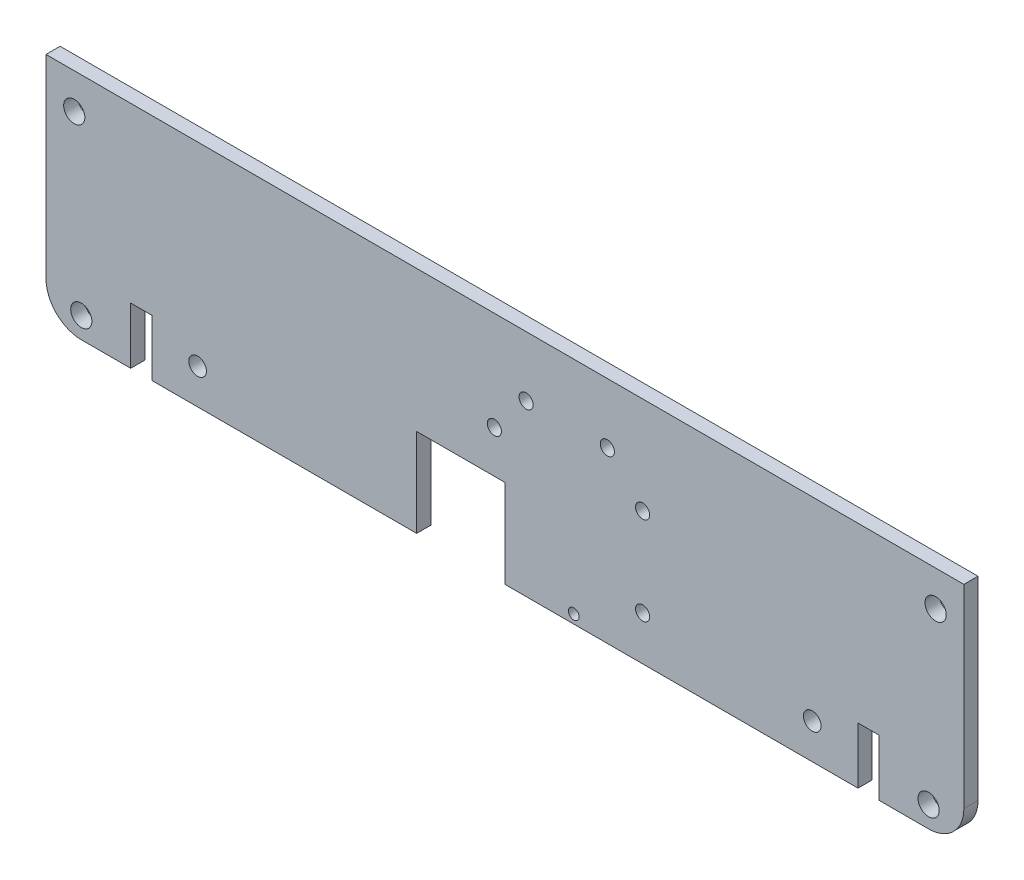
ISO-10303-21;
HEADER;
FILE_DESCRIPTION(('STEP AP214'),'2;1');
FILE_NAME('part.step','',(''),(''),'','','');
FILE_SCHEMA(('AUTOMOTIVE_DESIGN { 1 0 10303 214 1 1 1 1 }'));
ENDSEC;
DATA;
#1=APPLICATION_CONTEXT('core data for automotive mechanical design processes');
#2=APPLICATION_PROTOCOL_DEFINITION('international standard','automotive_design',2000,#1);
#3=PRODUCT_CONTEXT('',#1,'mechanical');
#4=PRODUCT('Part','Part','',(#3));
#5=PRODUCT_RELATED_PRODUCT_CATEGORY('part','',(#4));
#6=PRODUCT_DEFINITION_FORMATION('','',#4);
#7=PRODUCT_DEFINITION_CONTEXT('part definition',#1,'design');
#8=PRODUCT_DEFINITION('design','',#6,#7);
#9=PRODUCT_DEFINITION_SHAPE('','',#8);
#10=(LENGTH_UNIT() NAMED_UNIT(*) SI_UNIT(.MILLI.,.METRE.));
#11=(NAMED_UNIT(*) PLANE_ANGLE_UNIT() SI_UNIT($,.RADIAN.));
#12=(NAMED_UNIT(*) SI_UNIT($,.STERADIAN.) SOLID_ANGLE_UNIT());
#13=UNCERTAINTY_MEASURE_WITH_UNIT(LENGTH_MEASURE(1.E-05),#10,'distance_accuracy_value','');
#14=(GEOMETRIC_REPRESENTATION_CONTEXT(3) GLOBAL_UNCERTAINTY_ASSIGNED_CONTEXT((#13)) GLOBAL_UNIT_ASSIGNED_CONTEXT((#10,
#11,#12)) REPRESENTATION_CONTEXT('',''));
#15=CARTESIAN_POINT('',(0.,0.,0.));
#16=DIRECTION('',(0.,0.,1.));
#17=DIRECTION('',(1.,0.,0.));
#18=AXIS2_PLACEMENT_3D('',#15,#16,#17);
#19=CARTESIAN_POINT('',(-130.,-32.5,4.));
#20=DIRECTION('',(0.,1.,0.));
#21=DIRECTION('',(0.,0.,1.));
#22=AXIS2_PLACEMENT_3D('',#19,#20,#21);
#23=PLANE('',#22);
#24=DIRECTION('',(1.,0.,0.));
#25=VECTOR('',#24,1.);
#26=CARTESIAN_POINT('',(-130.,-32.5,4.));
#27=LINE('',#26,#25);
#28=CARTESIAN_POINT('',(-100.,-32.5,4.));
#29=VERTEX_POINT('',#28);
#30=CARTESIAN_POINT('',(-25.,-32.5,4.));
#31=VERTEX_POINT('',#30);
#32=EDGE_CURVE('E185',#29,#31,#27,.T.);
#33=ORIENTED_EDGE('',*,*,#32,.F.);
#34=DIRECTION('',(0.,0.,-1.));
#35=VECTOR('',#34,1.);
#36=CARTESIAN_POINT('',(-100.,-32.5,4.));
#37=LINE('',#36,#35);
#38=CARTESIAN_POINT('',(-100.,-32.5,0.));
#39=VERTEX_POINT('',#38);
#40=EDGE_CURVE('E275',#29,#39,#37,.T.);
#41=ORIENTED_EDGE('',*,*,#40,.T.);
#42=DIRECTION('',(1.,0.,0.));
#43=VECTOR('',#42,1.);
#44=CARTESIAN_POINT('',(-130.,-32.5,0.));
#45=LINE('',#44,#43);
#46=CARTESIAN_POINT('',(-25.,-32.5,0.));
#47=VERTEX_POINT('',#46);
#48=EDGE_CURVE('E375',#39,#47,#45,.T.);
#49=ORIENTED_EDGE('',*,*,#48,.T.);
#50=DIRECTION('',(0.,0.,-1.));
#51=VECTOR('',#50,1.);
#52=CARTESIAN_POINT('',(-25.,-32.5,10.));
#53=LINE('',#52,#51);
#54=EDGE_CURVE('E244',#31,#47,#53,.T.);
#55=ORIENTED_EDGE('',*,*,#54,.F.);
#56=EDGE_LOOP('',(#33,#41,#49,#55));
#57=FACE_BOUND('',#56,.T.);
#58=ADVANCED_FACE('F33',(#57),#23,.F.);
#59=CARTESIAN_POINT('',(106.,-32.5,4.));
#60=VERTEX_POINT('',#59);
#61=CARTESIAN_POINT('',(120.,-32.5,4.));
#62=VERTEX_POINT('',#61);
#63=EDGE_CURVE('E191',#60,#62,#27,.T.);
#64=ORIENTED_EDGE('',*,*,#63,.F.);
#65=DIRECTION('',(0.,0.,-1.));
#66=VECTOR('',#65,1.);
#67=CARTESIAN_POINT('',(106.,-32.5,4.));
#68=LINE('',#67,#66);
#69=CARTESIAN_POINT('',(106.,-32.5,0.));
#70=VERTEX_POINT('',#69);
#71=EDGE_CURVE('E259',#60,#70,#68,.T.);
#72=ORIENTED_EDGE('',*,*,#71,.T.);
#73=CARTESIAN_POINT('',(120.,-32.5,0.));
#74=VERTEX_POINT('',#73);
#75=EDGE_CURVE('E382',#70,#74,#45,.T.);
#76=ORIENTED_EDGE('',*,*,#75,.T.);
#77=DIRECTION('',(0.,0.,-1.));
#78=VECTOR('',#77,1.);
#79=CARTESIAN_POINT('',(120.,-32.5,4.));
#80=LINE('',#79,#78);
#81=EDGE_CURVE('E407',#74,#62,#80,.F.);
#82=ORIENTED_EDGE('',*,*,#81,.T.);
#83=EDGE_LOOP('',(#64,#72,#76,#82));
#84=FACE_BOUND('',#83,.T.);
#85=ADVANCED_FACE('F428',(#84),#23,.F.);
#86=CARTESIAN_POINT('',(0.,-32.5,0.));
#87=VERTEX_POINT('',#86);
#88=CARTESIAN_POINT('',(100.,-32.5,0.));
#89=VERTEX_POINT('',#88);
#90=EDGE_CURVE('E380',#87,#89,#45,.T.);
#91=ORIENTED_EDGE('',*,*,#90,.T.);
#92=DIRECTION('',(0.,0.,-1.));
#93=VECTOR('',#92,1.);
#94=CARTESIAN_POINT('',(100.,-32.5,4.));
#95=LINE('',#94,#93);
#96=CARTESIAN_POINT('',(100.,-32.5,4.));
#97=VERTEX_POINT('',#96);
#98=EDGE_CURVE('E56',#97,#89,#95,.T.);
#99=ORIENTED_EDGE('',*,*,#98,.F.);
#100=CARTESIAN_POINT('',(0.,-32.5,4.));
#101=VERTEX_POINT('',#100);
#102=EDGE_CURVE('E187',#101,#97,#27,.T.);
#103=ORIENTED_EDGE('',*,*,#102,.F.);
#104=DIRECTION('',(0.,0.,-1.));
#105=VECTOR('',#104,1.);
#106=CARTESIAN_POINT('',(0.,-32.5,10.));
#107=LINE('',#106,#105);
#108=EDGE_CURVE('E241',#101,#87,#107,.T.);
#109=ORIENTED_EDGE('',*,*,#108,.T.);
#110=EDGE_LOOP('',(#91,#99,#103,#109));
#111=FACE_BOUND('',#110,.T.);
#112=ADVANCED_FACE('F430',(#111),#23,.F.);
#113=CARTESIAN_POINT('',(130.,32.5,4.));
#114=DIRECTION('',(-1.,0.,0.));
#115=DIRECTION('',(0.,0.,1.));
#116=AXIS2_PLACEMENT_3D('',#113,#114,#115);
#117=PLANE('',#116);
#118=DIRECTION('',(0.,1.,0.));
#119=VECTOR('',#118,1.);
#120=CARTESIAN_POINT('',(130.,32.5,4.));
#121=LINE('',#120,#119);
#122=CARTESIAN_POINT('',(130.,-22.5,4.));
#123=VERTEX_POINT('',#122);
#124=CARTESIAN_POINT('',(130.,32.5,4.));
#125=VERTEX_POINT('',#124);
#126=EDGE_CURVE('E204',#123,#125,#121,.T.);
#127=ORIENTED_EDGE('',*,*,#126,.F.);
#128=DIRECTION('',(0.,0.,-1.));
#129=VECTOR('',#128,1.);
#130=CARTESIAN_POINT('',(130.,-22.5,4.));
#131=LINE('',#130,#129);
#132=CARTESIAN_POINT('',(130.,-22.5,0.));
#133=VERTEX_POINT('',#132);
#134=EDGE_CURVE('E11',#123,#133,#131,.T.);
#135=ORIENTED_EDGE('',*,*,#134,.T.);
#136=DIRECTION('',(0.,1.,0.));
#137=VECTOR('',#136,1.);
#138=CARTESIAN_POINT('',(130.,32.5,0.));
#139=LINE('',#138,#137);
#140=CARTESIAN_POINT('',(130.,32.5,0.));
#141=VERTEX_POINT('',#140);
#142=EDGE_CURVE('E215',#133,#141,#139,.T.);
#143=ORIENTED_EDGE('',*,*,#142,.T.);
#144=DIRECTION('',(0.,0.,-1.));
#145=VECTOR('',#144,1.);
#146=CARTESIAN_POINT('',(130.,32.5,4.));
#147=LINE('',#146,#145);
#148=EDGE_CURVE('E189',#125,#141,#147,.T.);
#149=ORIENTED_EDGE('',*,*,#148,.F.);
#150=EDGE_LOOP('',(#127,#135,#143,#149));
#151=FACE_BOUND('',#150,.T.);
#152=ADVANCED_FACE('F400',(#151),#117,.F.);
#153=CARTESIAN_POINT('',(-130.,32.5,4.));
#154=DIRECTION('',(0.,-1.,0.));
#155=DIRECTION('',(0.,0.,-1.));
#156=AXIS2_PLACEMENT_3D('',#153,#154,#155);
#157=PLANE('',#156);
#158=DIRECTION('',(-1.,0.,0.));
#159=VECTOR('',#158,1.);
#160=CARTESIAN_POINT('',(-130.,32.5,0.));
#161=LINE('',#160,#159);
#162=CARTESIAN_POINT('',(-130.,32.5,0.));
#163=VERTEX_POINT('',#162);
#164=EDGE_CURVE('E390',#141,#163,#161,.T.);
#165=ORIENTED_EDGE('',*,*,#164,.T.);
#166=DIRECTION('',(0.,0.,-1.));
#167=VECTOR('',#166,1.);
#168=CARTESIAN_POINT('',(-130.,32.5,4.));
#169=LINE('',#168,#167);
#170=CARTESIAN_POINT('',(-130.,32.5,4.));
#171=VERTEX_POINT('',#170);
#172=EDGE_CURVE('E184',#171,#163,#169,.T.);
#173=ORIENTED_EDGE('',*,*,#172,.F.);
#174=DIRECTION('',(-1.,0.,0.));
#175=VECTOR('',#174,1.);
#176=CARTESIAN_POINT('',(-130.,32.5,4.));
#177=LINE('',#176,#175);
#178=EDGE_CURVE('E202',#125,#171,#177,.T.);
#179=ORIENTED_EDGE('',*,*,#178,.F.);
#180=ORIENTED_EDGE('',*,*,#148,.T.);
#181=EDGE_LOOP('',(#165,#173,#179,#180));
#182=FACE_BOUND('',#181,.T.);
#183=ADVANCED_FACE('F406',(#182),#157,.F.);
#184=CARTESIAN_POINT('',(-130.,32.5,4.));
#185=DIRECTION('',(1.,0.,0.));
#186=DIRECTION('',(0.,0.,-1.));
#187=AXIS2_PLACEMENT_3D('',#184,#185,#186);
#188=PLANE('',#187);
#189=DIRECTION('',(0.,-1.,0.));
#190=VECTOR('',#189,1.);
#191=CARTESIAN_POINT('',(-130.,32.5,0.));
#192=LINE('',#191,#190);
#193=CARTESIAN_POINT('',(-130.,-22.5,0.));
#194=VERTEX_POINT('',#193);
#195=EDGE_CURVE('E385',#163,#194,#192,.T.);
#196=ORIENTED_EDGE('',*,*,#195,.T.);
#197=DIRECTION('',(0.,0.,-1.));
#198=VECTOR('',#197,1.);
#199=CARTESIAN_POINT('',(-130.,-22.5,4.));
#200=LINE('',#199,#198);
#201=CARTESIAN_POINT('',(-130.,-22.5,4.));
#202=VERTEX_POINT('',#201);
#203=EDGE_CURVE('E417',#194,#202,#200,.F.);
#204=ORIENTED_EDGE('',*,*,#203,.T.);
#205=DIRECTION('',(0.,-1.,0.));
#206=VECTOR('',#205,1.);
#207=CARTESIAN_POINT('',(-130.,32.5,4.));
#208=LINE('',#207,#206);
#209=EDGE_CURVE('E198',#171,#202,#208,.T.);
#210=ORIENTED_EDGE('',*,*,#209,.F.);
#211=ORIENTED_EDGE('',*,*,#172,.T.);
#212=EDGE_LOOP('',(#196,#204,#210,#211));
#213=FACE_BOUND('',#212,.T.);
#214=ADVANCED_FACE('F439',(#213),#188,.F.);
#215=CARTESIAN_POINT('',(-120.,-32.5,0.));
#216=VERTEX_POINT('',#215);
#217=CARTESIAN_POINT('',(-106.,-32.5,0.));
#218=VERTEX_POINT('',#217);
#219=EDGE_CURVE('E176',#216,#218,#45,.T.);
#220=ORIENTED_EDGE('',*,*,#219,.T.);
#221=DIRECTION('',(0.,0.,-1.));
#222=VECTOR('',#221,1.);
#223=CARTESIAN_POINT('',(-106.,-32.5,4.));
#224=LINE('',#223,#222);
#225=CARTESIAN_POINT('',(-106.,-32.5,4.));
#226=VERTEX_POINT('',#225);
#227=EDGE_CURVE('E48',#226,#218,#224,.T.);
#228=ORIENTED_EDGE('',*,*,#227,.F.);
#229=CARTESIAN_POINT('',(-120.,-32.5,4.));
#230=VERTEX_POINT('',#229);
#231=EDGE_CURVE('E173',#230,#226,#27,.T.);
#232=ORIENTED_EDGE('',*,*,#231,.F.);
#233=DIRECTION('',(0.,0.,-1.));
#234=VECTOR('',#233,1.);
#235=CARTESIAN_POINT('',(-120.,-32.5,4.));
#236=LINE('',#235,#234);
#237=EDGE_CURVE('E409',#230,#216,#236,.T.);
#238=ORIENTED_EDGE('',*,*,#237,.T.);
#239=EDGE_LOOP('',(#220,#228,#232,#238));
#240=FACE_BOUND('',#239,.T.);
#241=ADVANCED_FACE('F171',(#240),#23,.F.);
#242=CARTESIAN_POINT('',(0.,0.,4.));
#243=DIRECTION('',(0.,0.,1.));
#244=DIRECTION('',(1.,0.,0.));
#245=AXIS2_PLACEMENT_3D('',#242,#243,#244);
#246=PLANE('',#245);
#247=CARTESIAN_POINT('',(39.,5.,4.));
#248=DIRECTION('',(0.,0.,1.));
#249=DIRECTION('',(1.,0.,0.));
#250=AXIS2_PLACEMENT_3D('',#247,#248,#249);
#251=CIRCLE('',#250,2.);
#252=CARTESIAN_POINT('',(41.,5.,4.));
#253=VERTEX_POINT('',#252);
#254=EDGE_CURVE('E312',#253,#253,#251,.T.);
#255=ORIENTED_EDGE('',*,*,#254,.F.);
#256=EDGE_LOOP('',(#255));
#257=FACE_BOUND('',#256,.T.);
#258=CARTESIAN_POINT('',(29.,15.5,4.));
#259=DIRECTION('',(0.,0.,1.));
#260=DIRECTION('',(1.,0.,0.));
#261=AXIS2_PLACEMENT_3D('',#258,#259,#260);
#262=CIRCLE('',#261,2.);
#263=CARTESIAN_POINT('',(31.,15.5,4.));
#264=VERTEX_POINT('',#263);
#265=EDGE_CURVE('E315',#264,#264,#262,.T.);
#266=ORIENTED_EDGE('',*,*,#265,.F.);
#267=EDGE_LOOP('',(#266));
#268=FACE_BOUND('',#267,.T.);
#269=CARTESIAN_POINT('',(6.,15.5,4.));
#270=DIRECTION('',(0.,0.,1.));
#271=DIRECTION('',(1.,0.,0.));
#272=AXIS2_PLACEMENT_3D('',#269,#270,#271);
#273=CIRCLE('',#272,2.);
#274=CARTESIAN_POINT('',(8.,15.5,4.));
#275=VERTEX_POINT('',#274);
#276=EDGE_CURVE('E318',#275,#275,#273,.T.);
#277=ORIENTED_EDGE('',*,*,#276,.F.);
#278=EDGE_LOOP('',(#277));
#279=FACE_BOUND('',#278,.T.);
#280=CARTESIAN_POINT('',(-3.,4.5,4.));
#281=DIRECTION('',(0.,0.,1.));
#282=DIRECTION('',(1.,0.,0.));
#283=AXIS2_PLACEMENT_3D('',#280,#281,#282);
#284=CIRCLE('',#283,2.);
#285=CARTESIAN_POINT('',(-1.,4.5,4.));
#286=VERTEX_POINT('',#285);
#287=EDGE_CURVE('E321',#286,#286,#284,.T.);
#288=ORIENTED_EDGE('',*,*,#287,.F.);
#289=EDGE_LOOP('',(#288));
#290=FACE_BOUND('',#289,.T.);
#291=CARTESIAN_POINT('',(19.5,-30.,4.));
#292=DIRECTION('',(0.,0.,1.));
#293=DIRECTION('',(1.,0.,0.));
#294=AXIS2_PLACEMENT_3D('',#291,#292,#293);
#295=CIRCLE('',#294,1.5);
#296=CARTESIAN_POINT('',(21.,-30.,4.));
#297=VERTEX_POINT('',#296);
#298=EDGE_CURVE('E324',#297,#297,#295,.T.);
#299=ORIENTED_EDGE('',*,*,#298,.F.);
#300=EDGE_LOOP('',(#299));
#301=FACE_BOUND('',#300,.T.);
#302=CARTESIAN_POINT('',(39.,-20.,4.));
#303=DIRECTION('',(0.,0.,1.));
#304=DIRECTION('',(1.,0.,0.));
#305=AXIS2_PLACEMENT_3D('',#302,#303,#304);
#306=CIRCLE('',#305,2.);
#307=CARTESIAN_POINT('',(41.,-20.,4.));
#308=VERTEX_POINT('',#307);
#309=EDGE_CURVE('E304',#308,#308,#306,.T.);
#310=ORIENTED_EDGE('',*,*,#309,.F.);
#311=EDGE_LOOP('',(#310));
#312=FACE_BOUND('',#311,.T.);
#313=CARTESIAN_POINT('',(87.05,-22.5000000000007,4.));
#314=DIRECTION('',(0.,0.,-1.));
#315=DIRECTION('',(-1.,0.,0.));
#316=AXIS2_PLACEMENT_3D('',#313,#314,#315);
#317=CIRCLE('',#316,2.50000000000011);
#318=CARTESIAN_POINT('',(84.5499999999999,-22.5000000000007,4.));
#319=VERTEX_POINT('',#318);
#320=EDGE_CURVE('E298',#319,#319,#317,.T.);
#321=ORIENTED_EDGE('',*,*,#320,.T.);
#322=EDGE_LOOP('',(#321));
#323=FACE_BOUND('',#322,.T.);
#324=CARTESIAN_POINT('',(-87.05,-22.5000000000007,4.));
#325=DIRECTION('',(0.,0.,-1.));
#326=DIRECTION('',(-1.,0.,0.));
#327=AXIS2_PLACEMENT_3D('',#324,#325,#326);
#328=CIRCLE('',#327,2.50000000000019);
#329=CARTESIAN_POINT('',(-89.5500000000002,-22.5000000000007,4.));
#330=VERTEX_POINT('',#329);
#331=EDGE_CURVE('E292',#330,#330,#328,.T.);
#332=ORIENTED_EDGE('',*,*,#331,.T.);
#333=EDGE_LOOP('',(#332));
#334=FACE_BOUND('',#333,.T.);
#335=DIRECTION('',(0.,-1.,0.));
#336=VECTOR('',#335,1.);
#337=CARTESIAN_POINT('',(-100.,-32.5,4.));
#338=LINE('',#337,#336);
#339=CARTESIAN_POINT('',(-100.,-16.5,4.));
#340=VERTEX_POINT('',#339);
#341=EDGE_CURVE('E177',#340,#29,#338,.T.);
#342=ORIENTED_EDGE('',*,*,#341,.T.);
#343=ORIENTED_EDGE('',*,*,#32,.T.);
#344=DIRECTION('',(0.,-1.,0.));
#345=VECTOR('',#344,1.);
#346=CARTESIAN_POINT('',(-25.,0.,4.));
#347=LINE('',#346,#345);
#348=CARTESIAN_POINT('',(-25.,-7.49999999999998,4.));
#349=VERTEX_POINT('',#348);
#350=EDGE_CURVE('E237',#349,#31,#347,.T.);
#351=ORIENTED_EDGE('',*,*,#350,.F.);
#352=DIRECTION('',(-1.,0.,0.));
#353=VECTOR('',#352,1.);
#354=CARTESIAN_POINT('',(0.,-7.49999999999998,4.));
#355=LINE('',#354,#353);
#356=CARTESIAN_POINT('',(0.,-7.49999999999998,4.));
#357=VERTEX_POINT('',#356);
#358=EDGE_CURVE('E235',#357,#349,#355,.T.);
#359=ORIENTED_EDGE('',*,*,#358,.F.);
#360=DIRECTION('',(0.,1.,0.));
#361=VECTOR('',#360,1.);
#362=CARTESIAN_POINT('',(0.,0.,4.));
#363=LINE('',#362,#361);
#364=EDGE_CURVE('E226',#101,#357,#363,.T.);
#365=ORIENTED_EDGE('',*,*,#364,.F.);
#366=ORIENTED_EDGE('',*,*,#102,.T.);
#367=DIRECTION('',(0.,1.,0.));
#368=VECTOR('',#367,1.);
#369=CARTESIAN_POINT('',(100.,-32.5,4.));
#370=LINE('',#369,#368);
#371=CARTESIAN_POINT('',(100.,-16.5,4.));
#372=VERTEX_POINT('',#371);
#373=EDGE_CURVE('E278',#97,#372,#370,.T.);
#374=ORIENTED_EDGE('',*,*,#373,.T.);
#375=DIRECTION('',(1.,0.,0.));
#376=VECTOR('',#375,1.);
#377=CARTESIAN_POINT('',(106.,-16.5,4.));
#378=LINE('',#377,#376);
#379=CARTESIAN_POINT('',(106.,-16.5,4.));
#380=VERTEX_POINT('',#379);
#381=EDGE_CURVE('E262',#372,#380,#378,.T.);
#382=ORIENTED_EDGE('',*,*,#381,.T.);
#383=DIRECTION('',(0.,-1.,0.));
#384=VECTOR('',#383,1.);
#385=CARTESIAN_POINT('',(106.,-32.5,4.));
#386=LINE('',#385,#384);
#387=EDGE_CURVE('E270',#380,#60,#386,.T.);
#388=ORIENTED_EDGE('',*,*,#387,.T.);
#389=ORIENTED_EDGE('',*,*,#63,.T.);
#390=CARTESIAN_POINT('',(120.,-22.5,4.));
#391=DIRECTION('',(0.,0.,1.));
#392=DIRECTION('',(1.,0.,0.));
#393=AXIS2_PLACEMENT_3D('',#390,#391,#392);
#394=CIRCLE('',#393,10.);
#395=EDGE_CURVE('E419',#62,#123,#394,.T.);
#396=ORIENTED_EDGE('',*,*,#395,.T.);
#397=ORIENTED_EDGE('',*,*,#126,.T.);
#398=ORIENTED_EDGE('',*,*,#178,.T.);
#399=ORIENTED_EDGE('',*,*,#209,.T.);
#400=CARTESIAN_POINT('',(-120.,-22.5,4.));
#401=DIRECTION('',(0.,0.,1.));
#402=DIRECTION('',(1.,0.,0.));
#403=AXIS2_PLACEMENT_3D('',#400,#401,#402);
#404=CIRCLE('',#403,10.);
#405=EDGE_CURVE('E41',#202,#230,#404,.T.);
#406=ORIENTED_EDGE('',*,*,#405,.T.);
#407=ORIENTED_EDGE('',*,*,#231,.T.);
#408=DIRECTION('',(0.,1.,0.));
#409=VECTOR('',#408,1.);
#410=CARTESIAN_POINT('',(-106.,-32.5,4.));
#411=LINE('',#410,#409);
#412=CARTESIAN_POINT('',(-106.,-16.5,4.));
#413=VERTEX_POINT('',#412);
#414=EDGE_CURVE('E158',#226,#413,#411,.T.);
#415=ORIENTED_EDGE('',*,*,#414,.T.);
#416=DIRECTION('',(1.,0.,0.));
#417=VECTOR('',#416,1.);
#418=CARTESIAN_POINT('',(-106.,-16.5,4.));
#419=LINE('',#418,#417);
#420=EDGE_CURVE('E165',#413,#340,#419,.T.);
#421=ORIENTED_EDGE('',*,*,#420,.T.);
#422=EDGE_LOOP('',(#342,#343,#351,#359,#365,#366,#374,#382,#388,#389,#396,#397,#398,#399,#406,
#407,#415,#421));
#423=FACE_BOUND('',#422,.T.);
#424=CARTESIAN_POINT('',(120.,-26.5,4.));
#425=DIRECTION('',(0.,0.,-1.));
#426=DIRECTION('',(-1.,0.,0.));
#427=AXIS2_PLACEMENT_3D('',#424,#425,#426);
#428=CIRCLE('',#427,3.00000000000001);
#429=CARTESIAN_POINT('',(117.,-26.5,4.));
#430=VERTEX_POINT('',#429);
#431=EDGE_CURVE('E225',#430,#430,#428,.T.);
#432=ORIENTED_EDGE('',*,*,#431,.T.);
#433=EDGE_LOOP('',(#432));
#434=FACE_BOUND('',#433,.T.);
#435=CARTESIAN_POINT('',(-122.,22.4999999999999,4.));
#436=DIRECTION('',(0.,0.,-1.));
#437=DIRECTION('',(-1.,0.,0.));
#438=AXIS2_PLACEMENT_3D('',#435,#436,#437);
#439=CIRCLE('',#438,3.00000000000002);
#440=CARTESIAN_POINT('',(-125.,22.4999999999999,4.));
#441=VERTEX_POINT('',#440);
#442=EDGE_CURVE('E219',#441,#441,#439,.T.);
#443=ORIENTED_EDGE('',*,*,#442,.T.);
#444=EDGE_LOOP('',(#443));
#445=FACE_BOUND('',#444,.T.);
#446=CARTESIAN_POINT('',(122.,22.5,4.));
#447=DIRECTION('',(0.,0.,-1.));
#448=DIRECTION('',(-1.,0.,0.));
#449=AXIS2_PLACEMENT_3D('',#446,#447,#448);
#450=CIRCLE('',#449,3.00000000000001);
#451=CARTESIAN_POINT('',(119.,22.5,4.));
#452=VERTEX_POINT('',#451);
#453=EDGE_CURVE('E212',#452,#452,#450,.T.);
#454=ORIENTED_EDGE('',*,*,#453,.T.);
#455=EDGE_LOOP('',(#454));
#456=FACE_BOUND('',#455,.T.);
#457=CARTESIAN_POINT('',(-120.,-26.5,4.));
#458=DIRECTION('',(0.,0.,-1.));
#459=DIRECTION('',(-1.,0.,0.));
#460=AXIS2_PLACEMENT_3D('',#457,#458,#459);
#461=CIRCLE('',#460,2.99999999999999);
#462=CARTESIAN_POINT('',(-123.,-26.5,4.));
#463=VERTEX_POINT('',#462);
#464=EDGE_CURVE('E211',#463,#463,#461,.T.);
#465=ORIENTED_EDGE('',*,*,#464,.T.);
#466=EDGE_LOOP('',(#465));
#467=FACE_BOUND('',#466,.T.);
#468=ADVANCED_FACE('F180',(#257,#268,#279,#290,#301,#312,#323,#334,#423,#434,#445,#456,#467),
#246,.T.);
#469=CARTESIAN_POINT('',(0.,0.,0.));
#470=DIRECTION('',(0.,0.,1.));
#471=DIRECTION('',(1.,0.,0.));
#472=AXIS2_PLACEMENT_3D('',#469,#470,#471);
#473=PLANE('',#472);
#474=CARTESIAN_POINT('',(39.,5.,0.));
#475=DIRECTION('',(0.,0.,-1.));
#476=DIRECTION('',(-1.,0.,0.));
#477=AXIS2_PLACEMENT_3D('',#474,#475,#476);
#478=CIRCLE('',#477,2.);
#479=CARTESIAN_POINT('',(37.,5.,0.));
#480=VERTEX_POINT('',#479);
#481=EDGE_CURVE('E327',#480,#480,#478,.T.);
#482=ORIENTED_EDGE('',*,*,#481,.F.);
#483=EDGE_LOOP('',(#482));
#484=FACE_BOUND('',#483,.T.);
#485=CARTESIAN_POINT('',(29.,15.5,0.));
#486=DIRECTION('',(0.,0.,-1.));
#487=DIRECTION('',(-1.,0.,0.));
#488=AXIS2_PLACEMENT_3D('',#485,#486,#487);
#489=CIRCLE('',#488,2.);
#490=CARTESIAN_POINT('',(27.,15.5,0.));
#491=VERTEX_POINT('',#490);
#492=EDGE_CURVE('E337',#491,#491,#489,.T.);
#493=ORIENTED_EDGE('',*,*,#492,.F.);
#494=EDGE_LOOP('',(#493));
#495=FACE_BOUND('',#494,.T.);
#496=CARTESIAN_POINT('',(6.,15.5,0.));
#497=DIRECTION('',(0.,0.,-1.));
#498=DIRECTION('',(-1.,0.,0.));
#499=AXIS2_PLACEMENT_3D('',#496,#497,#498);
#500=CIRCLE('',#499,2.);
#501=CARTESIAN_POINT('',(4.,15.5,0.));
#502=VERTEX_POINT('',#501);
#503=EDGE_CURVE('E334',#502,#502,#500,.T.);
#504=ORIENTED_EDGE('',*,*,#503,.F.);
#505=EDGE_LOOP('',(#504));
#506=FACE_BOUND('',#505,.T.);
#507=CARTESIAN_POINT('',(-3.,4.5,0.));
#508=DIRECTION('',(0.,0.,-1.));
#509=DIRECTION('',(-1.,0.,0.));
#510=AXIS2_PLACEMENT_3D('',#507,#508,#509);
#511=CIRCLE('',#510,2.);
#512=CARTESIAN_POINT('',(-5.,4.5,0.));
#513=VERTEX_POINT('',#512);
#514=EDGE_CURVE('E331',#513,#513,#511,.T.);
#515=ORIENTED_EDGE('',*,*,#514,.F.);
#516=EDGE_LOOP('',(#515));
#517=FACE_BOUND('',#516,.T.);
#518=CARTESIAN_POINT('',(19.5,-30.,0.));
#519=DIRECTION('',(0.,0.,-1.));
#520=DIRECTION('',(-1.,0.,0.));
#521=AXIS2_PLACEMENT_3D('',#518,#519,#520);
#522=CIRCLE('',#521,1.5);
#523=CARTESIAN_POINT('',(18.,-30.,0.));
#524=VERTEX_POINT('',#523);
#525=EDGE_CURVE('E328',#524,#524,#522,.T.);
#526=ORIENTED_EDGE('',*,*,#525,.F.);
#527=EDGE_LOOP('',(#526));
#528=FACE_BOUND('',#527,.T.);
#529=CARTESIAN_POINT('',(39.,-20.,0.));
#530=DIRECTION('',(0.,0.,-1.));
#531=DIRECTION('',(-1.,0.,0.));
#532=AXIS2_PLACEMENT_3D('',#529,#530,#531);
#533=CIRCLE('',#532,2.);
#534=CARTESIAN_POINT('',(37.,-20.,0.));
#535=VERTEX_POINT('',#534);
#536=EDGE_CURVE('E309',#535,#535,#533,.T.);
#537=ORIENTED_EDGE('',*,*,#536,.F.);
#538=EDGE_LOOP('',(#537));
#539=FACE_BOUND('',#538,.T.);
#540=CARTESIAN_POINT('',(87.05,-22.5000000000007,0.));
#541=DIRECTION('',(0.,0.,-1.));
#542=DIRECTION('',(-1.,0.,0.));
#543=AXIS2_PLACEMENT_3D('',#540,#541,#542);
#544=CIRCLE('',#543,2.50000000000011);
#545=CARTESIAN_POINT('',(84.5499999999999,-22.5000000000007,0.));
#546=VERTEX_POINT('',#545);
#547=EDGE_CURVE('E301',#546,#546,#544,.T.);
#548=ORIENTED_EDGE('',*,*,#547,.F.);
#549=EDGE_LOOP('',(#548));
#550=FACE_BOUND('',#549,.T.);
#551=CARTESIAN_POINT('',(-87.05,-22.5000000000007,0.));
#552=DIRECTION('',(0.,0.,-1.));
#553=DIRECTION('',(-1.,0.,0.));
#554=AXIS2_PLACEMENT_3D('',#551,#552,#553);
#555=CIRCLE('',#554,2.50000000000019);
#556=CARTESIAN_POINT('',(-89.5500000000002,-22.5000000000007,0.));
#557=VERTEX_POINT('',#556);
#558=EDGE_CURVE('E295',#557,#557,#555,.T.);
#559=ORIENTED_EDGE('',*,*,#558,.F.);
#560=EDGE_LOOP('',(#559));
#561=FACE_BOUND('',#560,.T.);
#562=CARTESIAN_POINT('',(120.,-26.5,0.));
#563=DIRECTION('',(0.,0.,-1.));
#564=DIRECTION('',(-1.,0.,0.));
#565=AXIS2_PLACEMENT_3D('',#562,#563,#564);
#566=CIRCLE('',#565,3.00000000000001);
#567=CARTESIAN_POINT('',(117.,-26.5,0.));
#568=VERTEX_POINT('',#567);
#569=EDGE_CURVE('E222',#568,#568,#566,.T.);
#570=ORIENTED_EDGE('',*,*,#569,.F.);
#571=EDGE_LOOP('',(#570));
#572=FACE_BOUND('',#571,.T.);
#573=CARTESIAN_POINT('',(-122.,22.4999999999999,0.));
#574=DIRECTION('',(0.,0.,-1.));
#575=DIRECTION('',(-1.,0.,0.));
#576=AXIS2_PLACEMENT_3D('',#573,#574,#575);
#577=CIRCLE('',#576,3.00000000000002);
#578=CARTESIAN_POINT('',(-125.,22.4999999999999,0.));
#579=VERTEX_POINT('',#578);
#580=EDGE_CURVE('E229',#579,#579,#577,.T.);
#581=ORIENTED_EDGE('',*,*,#580,.F.);
#582=EDGE_LOOP('',(#581));
#583=FACE_BOUND('',#582,.T.);
#584=CARTESIAN_POINT('',(122.,22.5,0.));
#585=DIRECTION('',(0.,0.,-1.));
#586=DIRECTION('',(-1.,0.,0.));
#587=AXIS2_PLACEMENT_3D('',#584,#585,#586);
#588=CIRCLE('',#587,3.00000000000001);
#589=CARTESIAN_POINT('',(119.,22.5,0.));
#590=VERTEX_POINT('',#589);
#591=EDGE_CURVE('E216',#590,#590,#588,.T.);
#592=ORIENTED_EDGE('',*,*,#591,.F.);
#593=EDGE_LOOP('',(#592));
#594=FACE_BOUND('',#593,.T.);
#595=CARTESIAN_POINT('',(-120.,-26.5,0.));
#596=DIRECTION('',(0.,0.,-1.));
#597=DIRECTION('',(-1.,0.,0.));
#598=AXIS2_PLACEMENT_3D('',#595,#596,#597);
#599=CIRCLE('',#598,2.99999999999999);
#600=CARTESIAN_POINT('',(-123.,-26.5,0.));
#601=VERTEX_POINT('',#600);
#602=EDGE_CURVE('E208',#601,#601,#599,.T.);
#603=ORIENTED_EDGE('',*,*,#602,.F.);
#604=EDGE_LOOP('',(#603));
#605=FACE_BOUND('',#604,.T.);
#606=ORIENTED_EDGE('',*,*,#48,.F.);
#607=DIRECTION('',(0.,-1.,0.));
#608=VECTOR('',#607,1.);
#609=CARTESIAN_POINT('',(-100.,-32.5,0.));
#610=LINE('',#609,#608);
#611=CARTESIAN_POINT('',(-100.,-16.5,0.));
#612=VERTEX_POINT('',#611);
#613=EDGE_CURVE('E166',#612,#39,#610,.T.);
#614=ORIENTED_EDGE('',*,*,#613,.F.);
#615=DIRECTION('',(1.,0.,0.));
#616=VECTOR('',#615,1.);
#617=CARTESIAN_POINT('',(-106.,-16.5,0.));
#618=LINE('',#617,#616);
#619=CARTESIAN_POINT('',(-106.,-16.5,0.));
#620=VERTEX_POINT('',#619);
#621=EDGE_CURVE('E287',#620,#612,#618,.T.);
#622=ORIENTED_EDGE('',*,*,#621,.F.);
#623=DIRECTION('',(0.,1.,0.));
#624=VECTOR('',#623,1.);
#625=CARTESIAN_POINT('',(-106.,-32.5,0.));
#626=LINE('',#625,#624);
#627=EDGE_CURVE('E290',#218,#620,#626,.T.);
#628=ORIENTED_EDGE('',*,*,#627,.F.);
#629=ORIENTED_EDGE('',*,*,#219,.F.);
#630=CARTESIAN_POINT('',(-120.,-22.5,0.));
#631=DIRECTION('',(0.,0.,1.));
#632=DIRECTION('',(1.,0.,0.));
#633=AXIS2_PLACEMENT_3D('',#630,#631,#632);
#634=CIRCLE('',#633,10.);
#635=EDGE_CURVE('E415',#216,#194,#634,.F.);
#636=ORIENTED_EDGE('',*,*,#635,.T.);
#637=ORIENTED_EDGE('',*,*,#195,.F.);
#638=ORIENTED_EDGE('',*,*,#164,.F.);
#639=ORIENTED_EDGE('',*,*,#142,.F.);
#640=CARTESIAN_POINT('',(120.,-22.5,0.));
#641=DIRECTION('',(0.,0.,1.));
#642=DIRECTION('',(1.,0.,0.));
#643=AXIS2_PLACEMENT_3D('',#640,#641,#642);
#644=CIRCLE('',#643,10.);
#645=EDGE_CURVE('E413',#133,#74,#644,.F.);
#646=ORIENTED_EDGE('',*,*,#645,.T.);
#647=ORIENTED_EDGE('',*,*,#75,.F.);
#648=DIRECTION('',(0.,-1.,0.));
#649=VECTOR('',#648,1.);
#650=CARTESIAN_POINT('',(106.,-32.5,0.));
#651=LINE('',#650,#649);
#652=CARTESIAN_POINT('',(106.,-16.5,0.));
#653=VERTEX_POINT('',#652);
#654=EDGE_CURVE('E273',#653,#70,#651,.T.);
#655=ORIENTED_EDGE('',*,*,#654,.F.);
#656=DIRECTION('',(1.,0.,0.));
#657=VECTOR('',#656,1.);
#658=CARTESIAN_POINT('',(106.,-16.5,0.));
#659=LINE('',#658,#657);
#660=CARTESIAN_POINT('',(100.,-16.5,0.));
#661=VERTEX_POINT('',#660);
#662=EDGE_CURVE('E267',#661,#653,#659,.T.);
#663=ORIENTED_EDGE('',*,*,#662,.F.);
#664=DIRECTION('',(0.,1.,0.));
#665=VECTOR('',#664,1.);
#666=CARTESIAN_POINT('',(100.,-32.5,0.));
#667=LINE('',#666,#665);
#668=EDGE_CURVE('E271',#89,#661,#667,.T.);
#669=ORIENTED_EDGE('',*,*,#668,.F.);
#670=ORIENTED_EDGE('',*,*,#90,.F.);
#671=DIRECTION('',(0.,-1.,0.));
#672=VECTOR('',#671,1.);
#673=CARTESIAN_POINT('',(0.,-32.5,0.));
#674=LINE('',#673,#672);
#675=CARTESIAN_POINT('',(0.,-7.49999999999998,0.));
#676=VERTEX_POINT('',#675);
#677=EDGE_CURVE('E256',#676,#87,#674,.T.);
#678=ORIENTED_EDGE('',*,*,#677,.F.);
#679=DIRECTION('',(1.,0.,0.));
#680=VECTOR('',#679,1.);
#681=CARTESIAN_POINT('',(0.,-7.49999999999998,0.));
#682=LINE('',#681,#680);
#683=CARTESIAN_POINT('',(-25.,-7.49999999999998,0.));
#684=VERTEX_POINT('',#683);
#685=EDGE_CURVE('E245',#684,#676,#682,.T.);
#686=ORIENTED_EDGE('',*,*,#685,.F.);
#687=DIRECTION('',(0.,1.,0.));
#688=VECTOR('',#687,1.);
#689=CARTESIAN_POINT('',(-25.,-32.5,0.));
#690=LINE('',#689,#688);
#691=EDGE_CURVE('E253',#47,#684,#690,.T.);
#692=ORIENTED_EDGE('',*,*,#691,.F.);
#693=EDGE_LOOP('',(#606,#614,#622,#628,#629,#636,#637,#638,#639,#646,#647,#655,#663,#669,#670,
#678,#686,#692));
#694=FACE_BOUND('',#693,.T.);
#695=ADVANCED_FACE('F345',(#484,#495,#506,#517,#528,#539,#550,#561,#572,#583,#594,#605,#694),
#473,.F.);
#696=CARTESIAN_POINT('',(-120.,-26.5,4.));
#697=DIRECTION('',(0.,0.,-1.));
#698=DIRECTION('',(-1.,0.,0.));
#699=AXIS2_PLACEMENT_3D('',#696,#697,#698);
#700=CYLINDRICAL_SURFACE('',#699,2.99999999999999);
#701=ORIENTED_EDGE('',*,*,#464,.F.);
#702=EDGE_LOOP('',(#701));
#703=FACE_BOUND('',#702,.T.);
#704=ORIENTED_EDGE('',*,*,#602,.T.);
#705=EDGE_LOOP('',(#704));
#706=FACE_BOUND('',#705,.T.);
#707=ADVANCED_FACE('F348',(#703,#706),#700,.F.);
#708=CARTESIAN_POINT('',(122.,22.5,4.));
#709=DIRECTION('',(0.,0.,-1.));
#710=DIRECTION('',(-1.,0.,0.));
#711=AXIS2_PLACEMENT_3D('',#708,#709,#710);
#712=CYLINDRICAL_SURFACE('',#711,3.00000000000001);
#713=ORIENTED_EDGE('',*,*,#453,.F.);
#714=EDGE_LOOP('',(#713));
#715=FACE_BOUND('',#714,.T.);
#716=ORIENTED_EDGE('',*,*,#591,.T.);
#717=EDGE_LOOP('',(#716));
#718=FACE_BOUND('',#717,.T.);
#719=ADVANCED_FACE('F497',(#715,#718),#712,.F.);
#720=CARTESIAN_POINT('',(-122.,22.4999999999999,4.));
#721=DIRECTION('',(0.,0.,-1.));
#722=DIRECTION('',(-1.,0.,0.));
#723=AXIS2_PLACEMENT_3D('',#720,#721,#722);
#724=CYLINDRICAL_SURFACE('',#723,3.00000000000002);
#725=ORIENTED_EDGE('',*,*,#442,.F.);
#726=EDGE_LOOP('',(#725));
#727=FACE_BOUND('',#726,.T.);
#728=ORIENTED_EDGE('',*,*,#580,.T.);
#729=EDGE_LOOP('',(#728));
#730=FACE_BOUND('',#729,.T.);
#731=ADVANCED_FACE('F455',(#727,#730),#724,.F.);
#732=CARTESIAN_POINT('',(120.,-26.5,4.));
#733=DIRECTION('',(0.,0.,-1.));
#734=DIRECTION('',(-1.,0.,0.));
#735=AXIS2_PLACEMENT_3D('',#732,#733,#734);
#736=CYLINDRICAL_SURFACE('',#735,3.00000000000001);
#737=ORIENTED_EDGE('',*,*,#431,.F.);
#738=EDGE_LOOP('',(#737));
#739=FACE_BOUND('',#738,.T.);
#740=ORIENTED_EDGE('',*,*,#569,.T.);
#741=EDGE_LOOP('',(#740));
#742=FACE_BOUND('',#741,.T.);
#743=ADVANCED_FACE('F448',(#739,#742),#736,.F.);
#744=CARTESIAN_POINT('',(-120.,-22.5,4.));
#745=DIRECTION('',(0.,0.,-1.));
#746=DIRECTION('',(-1.,0.,0.));
#747=AXIS2_PLACEMENT_3D('',#744,#745,#746);
#748=CYLINDRICAL_SURFACE('',#747,10.);
#749=ORIENTED_EDGE('',*,*,#405,.F.);
#750=ORIENTED_EDGE('',*,*,#203,.F.);
#751=ORIENTED_EDGE('',*,*,#635,.F.);
#752=ORIENTED_EDGE('',*,*,#237,.F.);
#753=EDGE_LOOP('',(#749,#750,#751,#752));
#754=FACE_BOUND('',#753,.T.);
#755=ADVANCED_FACE('F446',(#754),#748,.T.);
#756=CARTESIAN_POINT('',(120.,-22.5,4.));
#757=DIRECTION('',(0.,0.,-1.));
#758=DIRECTION('',(-1.,0.,0.));
#759=AXIS2_PLACEMENT_3D('',#756,#757,#758);
#760=CYLINDRICAL_SURFACE('',#759,10.);
#761=ORIENTED_EDGE('',*,*,#395,.F.);
#762=ORIENTED_EDGE('',*,*,#81,.F.);
#763=ORIENTED_EDGE('',*,*,#645,.F.);
#764=ORIENTED_EDGE('',*,*,#134,.F.);
#765=EDGE_LOOP('',(#761,#762,#763,#764));
#766=FACE_BOUND('',#765,.T.);
#767=ADVANCED_FACE('F35',(#766),#760,.T.);
#768=CARTESIAN_POINT('',(0.,-32.5,10.));
#769=DIRECTION('',(1.,0.,0.));
#770=DIRECTION('',(0.,1.,0.));
#771=AXIS2_PLACEMENT_3D('',#768,#769,#770);
#772=PLANE('',#771);
#773=ORIENTED_EDGE('',*,*,#364,.T.);
#774=DIRECTION('',(0.,0.,-1.));
#775=VECTOR('',#774,1.);
#776=CARTESIAN_POINT('',(0.,-7.49999999999998,10.));
#777=LINE('',#776,#775);
#778=EDGE_CURVE('E240',#357,#676,#777,.T.);
#779=ORIENTED_EDGE('',*,*,#778,.T.);
#780=ORIENTED_EDGE('',*,*,#677,.T.);
#781=ORIENTED_EDGE('',*,*,#108,.F.);
#782=EDGE_LOOP('',(#773,#779,#780,#781));
#783=FACE_BOUND('',#782,.T.);
#784=ADVANCED_FACE('F454',(#783),#772,.F.);
#785=CARTESIAN_POINT('',(0.,-7.49999999999998,10.));
#786=DIRECTION('',(0.,1.,0.));
#787=DIRECTION('',(0.,0.,1.));
#788=AXIS2_PLACEMENT_3D('',#785,#786,#787);
#789=PLANE('',#788);
#790=ORIENTED_EDGE('',*,*,#358,.T.);
#791=DIRECTION('',(0.,0.,-1.));
#792=VECTOR('',#791,1.);
#793=CARTESIAN_POINT('',(-25.,-7.49999999999998,10.));
#794=LINE('',#793,#792);
#795=EDGE_CURVE('E248',#349,#684,#794,.T.);
#796=ORIENTED_EDGE('',*,*,#795,.T.);
#797=ORIENTED_EDGE('',*,*,#685,.T.);
#798=ORIENTED_EDGE('',*,*,#778,.F.);
#799=EDGE_LOOP('',(#790,#796,#797,#798));
#800=FACE_BOUND('',#799,.T.);
#801=ADVANCED_FACE('F470',(#800),#789,.F.);
#802=CARTESIAN_POINT('',(-25.,-32.5,10.));
#803=DIRECTION('',(-1.,0.,0.));
#804=DIRECTION('',(0.,0.,1.));
#805=AXIS2_PLACEMENT_3D('',#802,#803,#804);
#806=PLANE('',#805);
#807=ORIENTED_EDGE('',*,*,#350,.T.);
#808=ORIENTED_EDGE('',*,*,#54,.T.);
#809=ORIENTED_EDGE('',*,*,#691,.T.);
#810=ORIENTED_EDGE('',*,*,#795,.F.);
#811=EDGE_LOOP('',(#807,#808,#809,#810));
#812=FACE_BOUND('',#811,.T.);
#813=ADVANCED_FACE('F465',(#812),#806,.F.);
#814=CARTESIAN_POINT('',(106.,-32.5,4.));
#815=DIRECTION('',(1.,0.,0.));
#816=DIRECTION('',(0.,0.,-1.));
#817=AXIS2_PLACEMENT_3D('',#814,#815,#816);
#818=PLANE('',#817);
#819=ORIENTED_EDGE('',*,*,#654,.T.);
#820=ORIENTED_EDGE('',*,*,#71,.F.);
#821=ORIENTED_EDGE('',*,*,#387,.F.);
#822=DIRECTION('',(0.,0.,-1.));
#823=VECTOR('',#822,1.);
#824=CARTESIAN_POINT('',(106.,-16.5,4.));
#825=LINE('',#824,#823);
#826=EDGE_CURVE('E258',#380,#653,#825,.T.);
#827=ORIENTED_EDGE('',*,*,#826,.T.);
#828=EDGE_LOOP('',(#819,#820,#821,#827));
#829=FACE_BOUND('',#828,.T.);
#830=ADVANCED_FACE('F426',(#829),#818,.F.);
#831=CARTESIAN_POINT('',(106.,-16.5,4.));
#832=DIRECTION('',(0.,1.,0.));
#833=DIRECTION('',(0.,0.,1.));
#834=AXIS2_PLACEMENT_3D('',#831,#832,#833);
#835=PLANE('',#834);
#836=ORIENTED_EDGE('',*,*,#662,.T.);
#837=ORIENTED_EDGE('',*,*,#826,.F.);
#838=ORIENTED_EDGE('',*,*,#381,.F.);
#839=DIRECTION('',(0.,0.,-1.));
#840=VECTOR('',#839,1.);
#841=CARTESIAN_POINT('',(100.,-16.5,4.));
#842=LINE('',#841,#840);
#843=EDGE_CURVE('E264',#372,#661,#842,.T.);
#844=ORIENTED_EDGE('',*,*,#843,.T.);
#845=EDGE_LOOP('',(#836,#837,#838,#844));
#846=FACE_BOUND('',#845,.T.);
#847=ADVANCED_FACE('F477',(#846),#835,.F.);
#848=CARTESIAN_POINT('',(100.,-32.5,4.));
#849=DIRECTION('',(-1.,0.,0.));
#850=DIRECTION('',(0.,0.,1.));
#851=AXIS2_PLACEMENT_3D('',#848,#849,#850);
#852=PLANE('',#851);
#853=ORIENTED_EDGE('',*,*,#668,.T.);
#854=ORIENTED_EDGE('',*,*,#843,.F.);
#855=ORIENTED_EDGE('',*,*,#373,.F.);
#856=ORIENTED_EDGE('',*,*,#98,.T.);
#857=EDGE_LOOP('',(#853,#854,#855,#856));
#858=FACE_BOUND('',#857,.T.);
#859=ADVANCED_FACE('F474',(#858),#852,.F.);
#860=CARTESIAN_POINT('',(-100.,-32.5,4.));
#861=DIRECTION('',(1.,0.,0.));
#862=DIRECTION('',(0.,0.,-1.));
#863=AXIS2_PLACEMENT_3D('',#860,#861,#862);
#864=PLANE('',#863);
#865=ORIENTED_EDGE('',*,*,#613,.T.);
#866=ORIENTED_EDGE('',*,*,#40,.F.);
#867=ORIENTED_EDGE('',*,*,#341,.F.);
#868=DIRECTION('',(0.,0.,-1.));
#869=VECTOR('',#868,1.);
#870=CARTESIAN_POINT('',(-100.,-16.5,4.));
#871=LINE('',#870,#869);
#872=EDGE_CURVE('E282',#340,#612,#871,.T.);
#873=ORIENTED_EDGE('',*,*,#872,.T.);
#874=EDGE_LOOP('',(#865,#866,#867,#873));
#875=FACE_BOUND('',#874,.T.);
#876=ADVANCED_FACE('F484',(#875),#864,.F.);
#877=CARTESIAN_POINT('',(-106.,-16.5,4.));
#878=DIRECTION('',(0.,1.,0.));
#879=DIRECTION('',(0.,0.,1.));
#880=AXIS2_PLACEMENT_3D('',#877,#878,#879);
#881=PLANE('',#880);
#882=ORIENTED_EDGE('',*,*,#621,.T.);
#883=ORIENTED_EDGE('',*,*,#872,.F.);
#884=ORIENTED_EDGE('',*,*,#420,.F.);
#885=DIRECTION('',(0.,0.,-1.));
#886=VECTOR('',#885,1.);
#887=CARTESIAN_POINT('',(-106.,-16.5,4.));
#888=LINE('',#887,#886);
#889=EDGE_CURVE('E160',#413,#620,#888,.T.);
#890=ORIENTED_EDGE('',*,*,#889,.T.);
#891=EDGE_LOOP('',(#882,#883,#884,#890));
#892=FACE_BOUND('',#891,.T.);
#893=ADVANCED_FACE('F459',(#892),#881,.F.);
#894=CARTESIAN_POINT('',(-106.,-32.5,4.));
#895=DIRECTION('',(-1.,0.,0.));
#896=DIRECTION('',(0.,0.,1.));
#897=AXIS2_PLACEMENT_3D('',#894,#895,#896);
#898=PLANE('',#897);
#899=ORIENTED_EDGE('',*,*,#627,.T.);
#900=ORIENTED_EDGE('',*,*,#889,.F.);
#901=ORIENTED_EDGE('',*,*,#414,.F.);
#902=ORIENTED_EDGE('',*,*,#227,.T.);
#903=EDGE_LOOP('',(#899,#900,#901,#902));
#904=FACE_BOUND('',#903,.T.);
#905=ADVANCED_FACE('F159',(#904),#898,.F.);
#906=CARTESIAN_POINT('',(-87.05,-22.5000000000007,4.));
#907=DIRECTION('',(0.,0.,-1.));
#908=DIRECTION('',(-1.,0.,0.));
#909=AXIS2_PLACEMENT_3D('',#906,#907,#908);
#910=CYLINDRICAL_SURFACE('',#909,2.50000000000019);
#911=ORIENTED_EDGE('',*,*,#331,.F.);
#912=EDGE_LOOP('',(#911));
#913=FACE_BOUND('',#912,.T.);
#914=ORIENTED_EDGE('',*,*,#558,.T.);
#915=EDGE_LOOP('',(#914));
#916=FACE_BOUND('',#915,.T.);
#917=ADVANCED_FACE('F526',(#913,#916),#910,.F.);
#918=CARTESIAN_POINT('',(87.05,-22.5000000000007,4.));
#919=DIRECTION('',(0.,0.,-1.));
#920=DIRECTION('',(-1.,0.,0.));
#921=AXIS2_PLACEMENT_3D('',#918,#919,#920);
#922=CYLINDRICAL_SURFACE('',#921,2.50000000000011);
#923=ORIENTED_EDGE('',*,*,#320,.F.);
#924=EDGE_LOOP('',(#923));
#925=FACE_BOUND('',#924,.T.);
#926=ORIENTED_EDGE('',*,*,#547,.T.);
#927=EDGE_LOOP('',(#926));
#928=FACE_BOUND('',#927,.T.);
#929=ADVANCED_FACE('F529',(#925,#928),#922,.F.);
#930=CARTESIAN_POINT('',(39.,-20.,10.));
#931=DIRECTION('',(0.,0.,-1.));
#932=DIRECTION('',(-1.,0.,0.));
#933=AXIS2_PLACEMENT_3D('',#930,#931,#932);
#934=CYLINDRICAL_SURFACE('',#933,2.);
#935=ORIENTED_EDGE('',*,*,#309,.T.);
#936=EDGE_LOOP('',(#935));
#937=FACE_BOUND('',#936,.T.);
#938=ORIENTED_EDGE('',*,*,#536,.T.);
#939=EDGE_LOOP('',(#938));
#940=FACE_BOUND('',#939,.T.);
#941=ADVANCED_FACE('F535',(#937,#940),#934,.F.);
#942=CARTESIAN_POINT('',(19.5,-30.,10.));
#943=DIRECTION('',(0.,0.,-1.));
#944=DIRECTION('',(-1.,0.,0.));
#945=AXIS2_PLACEMENT_3D('',#942,#943,#944);
#946=CYLINDRICAL_SURFACE('',#945,1.5);
#947=ORIENTED_EDGE('',*,*,#298,.T.);
#948=EDGE_LOOP('',(#947));
#949=FACE_BOUND('',#948,.T.);
#950=ORIENTED_EDGE('',*,*,#525,.T.);
#951=EDGE_LOOP('',(#950));
#952=FACE_BOUND('',#951,.T.);
#953=ADVANCED_FACE('F568',(#949,#952),#946,.F.);
#954=CARTESIAN_POINT('',(-3.,4.5,10.));
#955=DIRECTION('',(0.,0.,-1.));
#956=DIRECTION('',(-1.,0.,0.));
#957=AXIS2_PLACEMENT_3D('',#954,#955,#956);
#958=CYLINDRICAL_SURFACE('',#957,2.);
#959=ORIENTED_EDGE('',*,*,#287,.T.);
#960=EDGE_LOOP('',(#959));
#961=FACE_BOUND('',#960,.T.);
#962=ORIENTED_EDGE('',*,*,#514,.T.);
#963=EDGE_LOOP('',(#962));
#964=FACE_BOUND('',#963,.T.);
#965=ADVANCED_FACE('F574',(#961,#964),#958,.F.);
#966=CARTESIAN_POINT('',(6.,15.5,10.));
#967=DIRECTION('',(0.,0.,-1.));
#968=DIRECTION('',(-1.,0.,0.));
#969=AXIS2_PLACEMENT_3D('',#966,#967,#968);
#970=CYLINDRICAL_SURFACE('',#969,2.);
#971=ORIENTED_EDGE('',*,*,#276,.T.);
#972=EDGE_LOOP('',(#971));
#973=FACE_BOUND('',#972,.T.);
#974=ORIENTED_EDGE('',*,*,#503,.T.);
#975=EDGE_LOOP('',(#974));
#976=FACE_BOUND('',#975,.T.);
#977=ADVANCED_FACE('F582',(#973,#976),#970,.F.);
#978=CARTESIAN_POINT('',(29.,15.5,10.));
#979=DIRECTION('',(0.,0.,-1.));
#980=DIRECTION('',(-1.,0.,0.));
#981=AXIS2_PLACEMENT_3D('',#978,#979,#980);
#982=CYLINDRICAL_SURFACE('',#981,2.);
#983=ORIENTED_EDGE('',*,*,#265,.T.);
#984=EDGE_LOOP('',(#983));
#985=FACE_BOUND('',#984,.T.);
#986=ORIENTED_EDGE('',*,*,#492,.T.);
#987=EDGE_LOOP('',(#986));
#988=FACE_BOUND('',#987,.T.);
#989=ADVANCED_FACE('F590',(#985,#988),#982,.F.);
#990=CARTESIAN_POINT('',(39.,5.,10.));
#991=DIRECTION('',(0.,0.,-1.));
#992=DIRECTION('',(-1.,0.,0.));
#993=AXIS2_PLACEMENT_3D('',#990,#991,#992);
#994=CYLINDRICAL_SURFACE('',#993,2.);
#995=ORIENTED_EDGE('',*,*,#254,.T.);
#996=EDGE_LOOP('',(#995));
#997=FACE_BOUND('',#996,.T.);
#998=ORIENTED_EDGE('',*,*,#481,.T.);
#999=EDGE_LOOP('',(#998));
#1000=FACE_BOUND('',#999,.T.);
#1001=ADVANCED_FACE('F343',(#997,#1000),#994,.F.);
#1002=CLOSED_SHELL('',(#58,#85,#112,#152,#183,#214,#241,#468,#695,#707,#719,#731,#743,#755,#767,
#784,#801,#813,#830,#847,#859,#876,#893,#905,#917,#929,#941,#953,#965,#977,#989,#1001));
#1003=MANIFOLD_SOLID_BREP('B2',#1002);
#1004=ADVANCED_BREP_SHAPE_REPRESENTATION('',(#18,#1003),#14);
#1005=SHAPE_DEFINITION_REPRESENTATION(#9,#1004);
ENDSEC;
END-ISO-10303-21;
